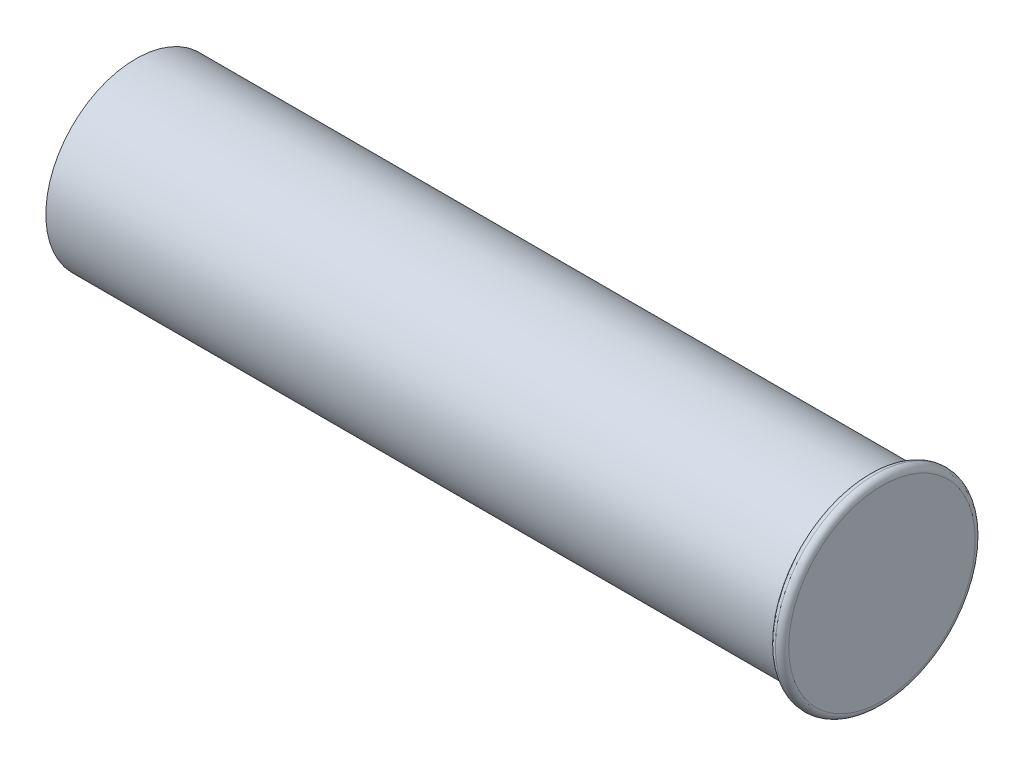
ISO-10303-21;
HEADER;
FILE_DESCRIPTION(('STEP AP214'),'2;1');
FILE_NAME('part.step','',(''),(''),'','','');
FILE_SCHEMA(('AUTOMOTIVE_DESIGN { 1 0 10303 214 1 1 1 1 }'));
ENDSEC;
DATA;
#1=APPLICATION_CONTEXT('core data for automotive mechanical design processes');
#2=APPLICATION_PROTOCOL_DEFINITION('international standard','automotive_design',2000,#1);
#3=PRODUCT_CONTEXT('',#1,'mechanical');
#4=PRODUCT('Part','Part','',(#3));
#5=PRODUCT_RELATED_PRODUCT_CATEGORY('part','',(#4));
#6=PRODUCT_DEFINITION_FORMATION('','',#4);
#7=PRODUCT_DEFINITION_CONTEXT('part definition',#1,'design');
#8=PRODUCT_DEFINITION('design','',#6,#7);
#9=PRODUCT_DEFINITION_SHAPE('','',#8);
#10=(LENGTH_UNIT() NAMED_UNIT(*) SI_UNIT(.MILLI.,.METRE.));
#11=(NAMED_UNIT(*) PLANE_ANGLE_UNIT() SI_UNIT($,.RADIAN.));
#12=(NAMED_UNIT(*) SI_UNIT($,.STERADIAN.) SOLID_ANGLE_UNIT());
#13=UNCERTAINTY_MEASURE_WITH_UNIT(LENGTH_MEASURE(1.E-05),#10,'distance_accuracy_value','');
#14=(GEOMETRIC_REPRESENTATION_CONTEXT(3) GLOBAL_UNCERTAINTY_ASSIGNED_CONTEXT((#13)) GLOBAL_UNIT_ASSIGNED_CONTEXT((#10,
#11,#12)) REPRESENTATION_CONTEXT('',''));
#15=CARTESIAN_POINT('',(0.,0.,0.));
#16=DIRECTION('',(0.,0.,1.));
#17=DIRECTION('',(1.,0.,0.));
#18=AXIS2_PLACEMENT_3D('',#15,#16,#17);
#19=CARTESIAN_POINT('',(0.,0.,0.));
#20=DIRECTION('',(1.,0.,0.));
#21=DIRECTION('',(0.,0.,-1.));
#22=AXIS2_PLACEMENT_3D('',#19,#20,#21);
#23=PLANE('',#22);
#24=CARTESIAN_POINT('',(0.,0.,0.));
#25=DIRECTION('',(1.,0.,0.));
#26=DIRECTION('',(0.,0.,-1.));
#27=AXIS2_PLACEMENT_3D('',#24,#25,#26);
#28=CIRCLE('',#27,13.5);
#29=CARTESIAN_POINT('',(0.,0.,-13.5));
#30=VERTEX_POINT('',#29);
#31=EDGE_CURVE('E60',#30,#30,#28,.T.);
#32=ORIENTED_EDGE('',*,*,#31,.F.);
#33=EDGE_LOOP('',(#32));
#34=FACE_BOUND('',#33,.T.);
#35=CARTESIAN_POINT('',(0.,0.,0.));
#36=DIRECTION('',(1.,0.,0.));
#37=DIRECTION('',(0.,0.,-1.));
#38=AXIS2_PLACEMENT_3D('',#35,#36,#37);
#39=CIRCLE('',#38,12.5);
#40=CARTESIAN_POINT('',(0.,0.,-12.5));
#41=VERTEX_POINT('',#40);
#42=EDGE_CURVE('E64',#41,#41,#39,.T.);
#43=ORIENTED_EDGE('',*,*,#42,.T.);
#44=EDGE_LOOP('',(#43));
#45=FACE_BOUND('',#44,.T.);
#46=ADVANCED_FACE('F43',(#34,#45),#23,.F.);
#47=CARTESIAN_POINT('',(110.,0.,0.));
#48=DIRECTION('',(-1.,0.,0.));
#49=DIRECTION('',(0.,0.,1.));
#50=AXIS2_PLACEMENT_3D('',#47,#48,#49);
#51=CYLINDRICAL_SURFACE('',#50,13.5);
#52=CARTESIAN_POINT('',(110.,0.,0.));
#53=DIRECTION('',(1.,0.,0.));
#54=DIRECTION('',(0.,0.,-1.));
#55=AXIS2_PLACEMENT_3D('',#52,#53,#54);
#56=CIRCLE('',#55,13.5);
#57=CARTESIAN_POINT('',(110.,0.,-13.5));
#58=VERTEX_POINT('',#57);
#59=EDGE_CURVE('E57',#58,#58,#56,.T.);
#60=ORIENTED_EDGE('',*,*,#59,.F.);
#61=EDGE_LOOP('',(#60));
#62=FACE_BOUND('',#61,.T.);
#63=ORIENTED_EDGE('',*,*,#31,.T.);
#64=EDGE_LOOP('',(#63));
#65=FACE_BOUND('',#64,.T.);
#66=ADVANCED_FACE('F95',(#62,#65),#51,.T.);
#67=CARTESIAN_POINT('',(110.,0.,0.));
#68=DIRECTION('',(-1.,0.,0.));
#69=DIRECTION('',(0.,0.,1.));
#70=AXIS2_PLACEMENT_3D('',#67,#68,#69);
#71=CYLINDRICAL_SURFACE('',#70,12.5);
#72=CARTESIAN_POINT('',(110.,0.,0.));
#73=DIRECTION('',(1.,0.,0.));
#74=DIRECTION('',(0.,0.,-1.));
#75=AXIS2_PLACEMENT_3D('',#72,#73,#74);
#76=CIRCLE('',#75,12.5);
#77=CARTESIAN_POINT('',(110.,0.,-12.5));
#78=VERTEX_POINT('',#77);
#79=EDGE_CURVE('E71',#78,#78,#76,.T.);
#80=ORIENTED_EDGE('',*,*,#79,.T.);
#81=EDGE_LOOP('',(#80));
#82=FACE_BOUND('',#81,.T.);
#83=ORIENTED_EDGE('',*,*,#42,.F.);
#84=EDGE_LOOP('',(#83));
#85=FACE_BOUND('',#84,.T.);
#86=ADVANCED_FACE('F101',(#82,#85),#71,.F.);
#87=CARTESIAN_POINT('',(110.,0.,0.));
#88=DIRECTION('',(1.,0.,0.));
#89=DIRECTION('',(0.,0.,-1.));
#90=AXIS2_PLACEMENT_3D('',#87,#88,#89);
#91=PLANE('',#90);
#92=ORIENTED_EDGE('',*,*,#79,.F.);
#93=EDGE_LOOP('',(#92));
#94=FACE_BOUND('',#93,.T.);
#95=ADVANCED_FACE('F93',(#94),#91,.F.);
#96=CARTESIAN_POINT('',(112.,0.,0.));
#97=DIRECTION('',(1.,0.,0.));
#98=DIRECTION('',(0.,0.,-1.));
#99=AXIS2_PLACEMENT_3D('',#96,#97,#98);
#100=PLANE('',#99);
#101=CARTESIAN_POINT('',(112.,0.,0.));
#102=DIRECTION('',(1.,0.,0.));
#103=DIRECTION('',(0.,0.,-1.));
#104=AXIS2_PLACEMENT_3D('',#101,#102,#103);
#105=CIRCLE('',#104,14.);
#106=CARTESIAN_POINT('',(112.,0.,-14.));
#107=VERTEX_POINT('',#106);
#108=EDGE_CURVE('E10',#107,#107,#105,.T.);
#109=ORIENTED_EDGE('',*,*,#108,.T.);
#110=EDGE_LOOP('',(#109));
#111=FACE_BOUND('',#110,.T.);
#112=ADVANCED_FACE('F90',(#111),#100,.T.);
#113=CARTESIAN_POINT('',(110.,0.,0.));
#114=DIRECTION('',(1.,0.,0.));
#115=DIRECTION('',(0.,0.,-1.));
#116=AXIS2_PLACEMENT_3D('',#113,#114,#115);
#117=CIRCLE('',#116,14.);
#118=CARTESIAN_POINT('',(110.,0.,-14.));
#119=VERTEX_POINT('',#118);
#120=EDGE_CURVE('E52',#119,#119,#117,.F.);
#121=ORIENTED_EDGE('',*,*,#120,.T.);
#122=EDGE_LOOP('',(#121));
#123=FACE_BOUND('',#122,.T.);
#124=ORIENTED_EDGE('',*,*,#59,.T.);
#125=EDGE_LOOP('',(#124));
#126=FACE_BOUND('',#125,.T.);
#127=ADVANCED_FACE('F83',(#123,#126),#91,.F.);
#128=CARTESIAN_POINT('',(111.,0.,0.));
#129=DIRECTION('',(1.,0.,0.));
#130=DIRECTION('',(0.,0.,-1.));
#131=AXIS2_PLACEMENT_3D('',#128,#129,#130);
#132=TOROIDAL_SURFACE('',#131,14.,1.);
#133=ORIENTED_EDGE('',*,*,#108,.F.);
#134=EDGE_LOOP('',(#133));
#135=FACE_BOUND('',#134,.T.);
#136=CARTESIAN_POINT('',(111.,0.,0.));
#137=DIRECTION('',(1.,0.,0.));
#138=DIRECTION('',(0.,0.,-1.));
#139=AXIS2_PLACEMENT_3D('',#136,#137,#138);
#140=CIRCLE('',#139,15.);
#141=CARTESIAN_POINT('',(111.,0.,-15.));
#142=VERTEX_POINT('',#141);
#143=EDGE_CURVE('E47',#142,#142,#140,.F.);
#144=ORIENTED_EDGE('',*,*,#143,.F.);
#145=EDGE_LOOP('',(#144));
#146=FACE_BOUND('',#145,.T.);
#147=ADVANCED_FACE('F45',(#135,#146),#132,.T.);
#148=CARTESIAN_POINT('',(111.,0.,0.));
#149=DIRECTION('',(1.,0.,0.));
#150=DIRECTION('',(0.,0.,-1.));
#151=AXIS2_PLACEMENT_3D('',#148,#149,#150);
#152=TOROIDAL_SURFACE('',#151,14.,1.);
#153=ORIENTED_EDGE('',*,*,#120,.F.);
#154=EDGE_LOOP('',(#153));
#155=FACE_BOUND('',#154,.T.);
#156=ORIENTED_EDGE('',*,*,#143,.T.);
#157=EDGE_LOOP('',(#156));
#158=FACE_BOUND('',#157,.T.);
#159=ADVANCED_FACE('F80',(#155,#158),#152,.T.);
#160=CLOSED_SHELL('',(#46,#66,#86,#95,#112,#127,#147,#159));
#161=MANIFOLD_SOLID_BREP('B2',#160);
#162=ADVANCED_BREP_SHAPE_REPRESENTATION('',(#18,#161),#14);
#163=SHAPE_DEFINITION_REPRESENTATION(#9,#162);
ENDSEC;
END-ISO-10303-21;
